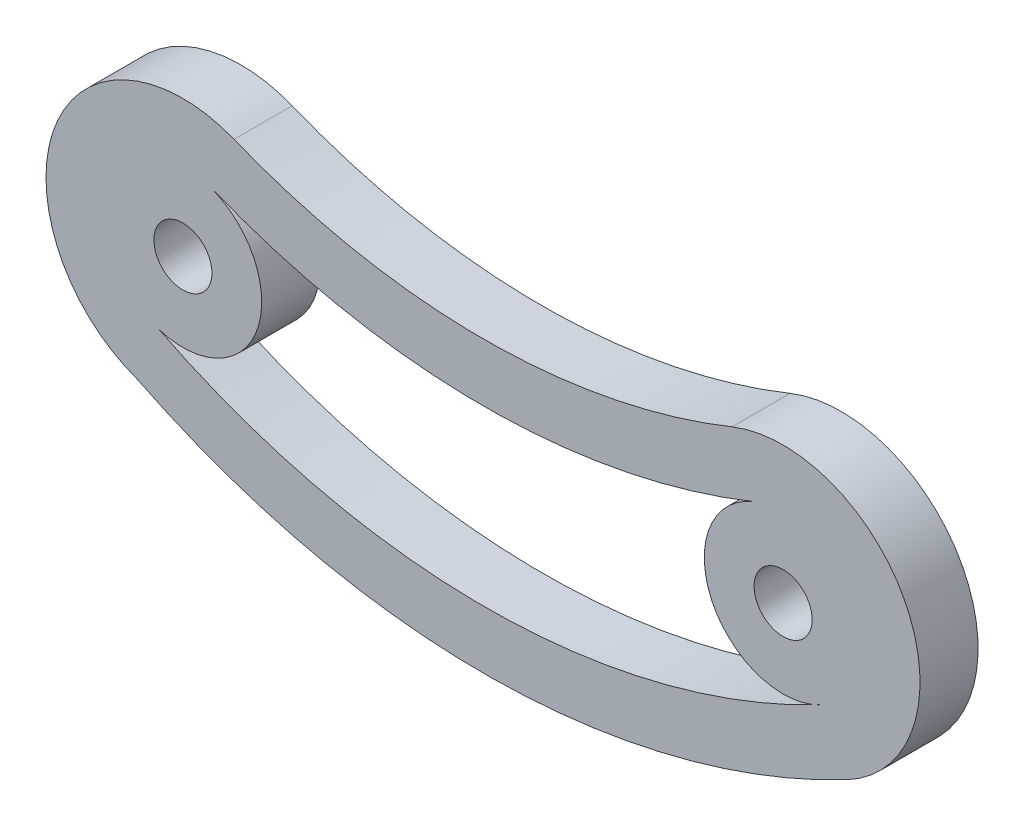
ISO-10303-21;
HEADER;
FILE_DESCRIPTION(('STEP AP214'),'2;1');
FILE_NAME('part.step','',(''),(''),'','','');
FILE_SCHEMA(('AUTOMOTIVE_DESIGN { 1 0 10303 214 1 1 1 1 }'));
ENDSEC;
DATA;
#1=APPLICATION_CONTEXT('core data for automotive mechanical design processes');
#2=APPLICATION_PROTOCOL_DEFINITION('international standard','automotive_design',2000,#1);
#3=PRODUCT_CONTEXT('',#1,'mechanical');
#4=PRODUCT('Part','Part','',(#3));
#5=PRODUCT_RELATED_PRODUCT_CATEGORY('part','',(#4));
#6=PRODUCT_DEFINITION_FORMATION('','',#4);
#7=PRODUCT_DEFINITION_CONTEXT('part definition',#1,'design');
#8=PRODUCT_DEFINITION('design','',#6,#7);
#9=PRODUCT_DEFINITION_SHAPE('','',#8);
#10=(LENGTH_UNIT() NAMED_UNIT(*) SI_UNIT(.MILLI.,.METRE.));
#11=(NAMED_UNIT(*) PLANE_ANGLE_UNIT() SI_UNIT($,.RADIAN.));
#12=(NAMED_UNIT(*) SI_UNIT($,.STERADIAN.) SOLID_ANGLE_UNIT());
#13=UNCERTAINTY_MEASURE_WITH_UNIT(LENGTH_MEASURE(1.E-05),#10,'distance_accuracy_value','');
#14=(GEOMETRIC_REPRESENTATION_CONTEXT(3) GLOBAL_UNCERTAINTY_ASSIGNED_CONTEXT((#13)) GLOBAL_UNIT_ASSIGNED_CONTEXT((#10,
#11,#12)) REPRESENTATION_CONTEXT('',''));
#15=CARTESIAN_POINT('',(0.,0.,0.));
#16=DIRECTION('',(0.,0.,1.));
#17=DIRECTION('',(1.,0.,0.));
#18=AXIS2_PLACEMENT_3D('',#15,#16,#17);
#19=CARTESIAN_POINT('',(15.5,-32.9667926412662,-3.));
#20=DIRECTION('',(0.,0.,-1.));
#21=DIRECTION('',(1.,0.,0.));
#22=AXIS2_PLACEMENT_3D('',#19,#20,#21);
#23=PLANE('',#22);
#24=CARTESIAN_POINT('',(31.,0.,-3.));
#25=DIRECTION('',(0.,0.,1.));
#26=DIRECTION('',(1.,0.,0.));
#27=AXIS2_PLACEMENT_3D('',#24,#25,#26);
#28=CIRCLE('',#27,1.5);
#29=CARTESIAN_POINT('',(32.5,0.,-3.));
#30=VERTEX_POINT('',#29);
#31=EDGE_CURVE('E43',#30,#30,#28,.T.);
#32=ORIENTED_EDGE('',*,*,#31,.T.);
#33=EDGE_LOOP('',(#32));
#34=FACE_BOUND('',#33,.T.);
#35=CARTESIAN_POINT('',(0.,0.,-3.));
#36=DIRECTION('',(0.,0.,1.));
#37=DIRECTION('',(1.,0.,0.));
#38=AXIS2_PLACEMENT_3D('',#35,#36,#37);
#39=CIRCLE('',#38,1.5);
#40=CARTESIAN_POINT('',(1.5,0.,-3.));
#41=VERTEX_POINT('',#40);
#42=EDGE_CURVE('E11',#41,#41,#39,.T.);
#43=ORIENTED_EDGE('',*,*,#42,.T.);
#44=EDGE_LOOP('',(#43));
#45=FACE_BOUND('',#44,.T.);
#46=CARTESIAN_POINT('',(0.,0.,-3.));
#47=DIRECTION('',(0.,0.,-1.));
#48=DIRECTION('',(-1.,0.,0.));
#49=AXIS2_PLACEMENT_3D('',#46,#47,#48);
#50=CIRCLE('',#49,7.07106781186548);
#51=CARTESIAN_POINT('',(-2.39609766795524,-6.65272244766152,-3.));
#52=VERTEX_POINT('',#51);
#53=CARTESIAN_POINT('',(2.63952486729692,6.55994729208408,-3.));
#54=VERTEX_POINT('',#53);
#55=EDGE_CURVE('E157',#52,#54,#50,.T.);
#56=ORIENTED_EDGE('',*,*,#55,.T.);
#57=CARTESIAN_POINT('',(15.5,38.5217749933269,-3.));
#58=DIRECTION('',(0.,0.,-1.));
#59=DIRECTION('',(-1.,0.,0.));
#60=AXIS2_PLACEMENT_3D('',#57,#58,#59);
#61=CIRCLE('',#60,34.452144354783);
#62=CARTESIAN_POINT('',(28.3604751327031,6.55994729208408,-3.));
#63=VERTEX_POINT('',#62);
#64=EDGE_CURVE('E147',#54,#63,#61,.F.);
#65=ORIENTED_EDGE('',*,*,#64,.T.);
#66=CARTESIAN_POINT('',(31.,0.,-3.));
#67=DIRECTION('',(0.,0.,-1.));
#68=DIRECTION('',(-1.,0.,0.));
#69=AXIS2_PLACEMENT_3D('',#66,#67,#68);
#70=CIRCLE('',#69,7.07106781186548);
#71=CARTESIAN_POINT('',(34.2886742958806,-6.25976208618301,-3.));
#72=VERTEX_POINT('',#71);
#73=EDGE_CURVE('E163',#63,#72,#70,.T.);
#74=ORIENTED_EDGE('',*,*,#73,.T.);
#75=CARTESIAN_POINT('',(15.5623695477377,29.3844525517841,-3.));
#76=DIRECTION('',(0.,0.,-1.));
#77=DIRECTION('',(-1.,0.,0.));
#78=AXIS2_PLACEMENT_3D('',#75,#76,#77);
#79=CIRCLE('',#78,40.2639358070941);
#80=EDGE_CURVE('E137',#52,#72,#79,.F.);
#81=ORIENTED_EDGE('',*,*,#80,.F.);
#82=EDGE_LOOP('',(#56,#65,#74,#81));
#83=FACE_BOUND('',#82,.T.);
#84=CARTESIAN_POINT('',(0.,0.,-3.));
#85=DIRECTION('',(0.,0.,1.));
#86=DIRECTION('',(1.,0.,0.));
#87=AXIS2_PLACEMENT_3D('',#84,#85,#86);
#88=CIRCLE('',#87,4.07106781186548);
#89=CARTESIAN_POINT('',(-1.23316593848006,-3.87980603857716,-3.));
#90=VERTEX_POINT('',#89);
#91=CARTESIAN_POINT('',(1.51966930763122,3.77679736340869,-3.));
#92=VERTEX_POINT('',#91);
#93=EDGE_CURVE('E131',#90,#92,#88,.T.);
#94=ORIENTED_EDGE('',*,*,#93,.F.);
#95=CARTESIAN_POINT('',(15.5623695477377,29.3844525517841,-3.));
#96=DIRECTION('',(0.,0.,1.));
#97=DIRECTION('',(1.,0.,0.));
#98=AXIS2_PLACEMENT_3D('',#95,#96,#97);
#99=CIRCLE('',#98,37.2639358070941);
#100=CARTESIAN_POINT('',(32.893407958442,-3.60396995433033,-3.));
#101=VERTEX_POINT('',#100);
#102=EDGE_CURVE('E129',#90,#101,#99,.T.);
#103=ORIENTED_EDGE('',*,*,#102,.T.);
#104=CARTESIAN_POINT('',(31.,0.,-3.));
#105=DIRECTION('',(0.,0.,1.));
#106=DIRECTION('',(1.,0.,0.));
#107=AXIS2_PLACEMENT_3D('',#104,#105,#106);
#108=CIRCLE('',#107,4.07106781186548);
#109=CARTESIAN_POINT('',(29.4803306923688,3.77679736340869,-3.));
#110=VERTEX_POINT('',#109);
#111=EDGE_CURVE('E106',#110,#101,#108,.T.);
#112=ORIENTED_EDGE('',*,*,#111,.F.);
#113=CARTESIAN_POINT('',(15.5,38.5217749933269,-3.));
#114=DIRECTION('',(0.,0.,1.));
#115=DIRECTION('',(1.,0.,0.));
#116=AXIS2_PLACEMENT_3D('',#113,#114,#115);
#117=CIRCLE('',#116,37.452144354783);
#118=EDGE_CURVE('E134',#92,#110,#117,.T.);
#119=ORIENTED_EDGE('',*,*,#118,.F.);
#120=EDGE_LOOP('',(#94,#103,#112,#119));
#121=FACE_BOUND('',#120,.T.);
#122=ADVANCED_FACE('F34',(#34,#45,#83,#121),#23,.T.);
#123=CARTESIAN_POINT('',(15.5,-32.9667926412662,0.));
#124=DIRECTION('',(0.,0.,-1.));
#125=DIRECTION('',(1.,0.,0.));
#126=AXIS2_PLACEMENT_3D('',#123,#124,#125);
#127=PLANE('',#126);
#128=CARTESIAN_POINT('',(31.,0.,0.));
#129=DIRECTION('',(0.,0.,1.));
#130=DIRECTION('',(1.,0.,0.));
#131=AXIS2_PLACEMENT_3D('',#128,#129,#130);
#132=CIRCLE('',#131,1.5);
#133=CARTESIAN_POINT('',(32.5,0.,0.));
#134=VERTEX_POINT('',#133);
#135=EDGE_CURVE('E166',#134,#134,#132,.T.);
#136=ORIENTED_EDGE('',*,*,#135,.F.);
#137=EDGE_LOOP('',(#136));
#138=FACE_BOUND('',#137,.T.);
#139=CARTESIAN_POINT('',(0.,0.,0.));
#140=DIRECTION('',(0.,0.,1.));
#141=DIRECTION('',(1.,0.,0.));
#142=AXIS2_PLACEMENT_3D('',#139,#140,#141);
#143=CIRCLE('',#142,1.5);
#144=CARTESIAN_POINT('',(1.5,0.,0.));
#145=VERTEX_POINT('',#144);
#146=EDGE_CURVE('E38',#145,#145,#143,.T.);
#147=ORIENTED_EDGE('',*,*,#146,.F.);
#148=EDGE_LOOP('',(#147));
#149=FACE_BOUND('',#148,.T.);
#150=CARTESIAN_POINT('',(15.5623695477377,29.3844525517841,0.));
#151=DIRECTION('',(0.,0.,-1.));
#152=DIRECTION('',(-1.,0.,0.));
#153=AXIS2_PLACEMENT_3D('',#150,#151,#152);
#154=CIRCLE('',#153,40.2639358070941);
#155=CARTESIAN_POINT('',(-2.39609766795524,-6.65272244766152,0.));
#156=VERTEX_POINT('',#155);
#157=CARTESIAN_POINT('',(34.2886742958806,-6.25976208618301,0.));
#158=VERTEX_POINT('',#157);
#159=EDGE_CURVE('E136',#156,#158,#154,.F.);
#160=ORIENTED_EDGE('',*,*,#159,.T.);
#161=CARTESIAN_POINT('',(31.,0.,0.));
#162=DIRECTION('',(0.,0.,-1.));
#163=DIRECTION('',(-1.,0.,0.));
#164=AXIS2_PLACEMENT_3D('',#161,#162,#163);
#165=CIRCLE('',#164,7.07106781186548);
#166=CARTESIAN_POINT('',(28.3604751327031,6.55994729208408,0.));
#167=VERTEX_POINT('',#166);
#168=EDGE_CURVE('E160',#167,#158,#165,.T.);
#169=ORIENTED_EDGE('',*,*,#168,.F.);
#170=CARTESIAN_POINT('',(15.5,38.5217749933269,0.));
#171=DIRECTION('',(0.,0.,-1.));
#172=DIRECTION('',(-1.,0.,0.));
#173=AXIS2_PLACEMENT_3D('',#170,#171,#172);
#174=CIRCLE('',#173,34.452144354783);
#175=CARTESIAN_POINT('',(2.63952486729692,6.55994729208408,0.));
#176=VERTEX_POINT('',#175);
#177=EDGE_CURVE('E145',#176,#167,#174,.F.);
#178=ORIENTED_EDGE('',*,*,#177,.F.);
#179=CARTESIAN_POINT('',(0.,0.,0.));
#180=DIRECTION('',(0.,0.,-1.));
#181=DIRECTION('',(-1.,0.,0.));
#182=AXIS2_PLACEMENT_3D('',#179,#180,#181);
#183=CIRCLE('',#182,7.07106781186548);
#184=EDGE_CURVE('E155',#156,#176,#183,.T.);
#185=ORIENTED_EDGE('',*,*,#184,.F.);
#186=EDGE_LOOP('',(#160,#169,#178,#185));
#187=FACE_BOUND('',#186,.T.);
#188=CARTESIAN_POINT('',(15.5,38.5217749933269,0.));
#189=DIRECTION('',(0.,0.,-1.));
#190=DIRECTION('',(-1.,0.,0.));
#191=AXIS2_PLACEMENT_3D('',#188,#189,#190);
#192=CIRCLE('',#191,37.452144354783);
#193=CARTESIAN_POINT('',(29.4803306923688,3.77679736340869,0.));
#194=VERTEX_POINT('',#193);
#195=CARTESIAN_POINT('',(1.51966930763122,3.77679736340869,0.));
#196=VERTEX_POINT('',#195);
#197=EDGE_CURVE('E119',#194,#196,#192,.T.);
#198=ORIENTED_EDGE('',*,*,#197,.F.);
#199=CARTESIAN_POINT('',(31.,0.,0.));
#200=DIRECTION('',(0.,0.,-1.));
#201=DIRECTION('',(-1.,0.,0.));
#202=AXIS2_PLACEMENT_3D('',#199,#200,#201);
#203=CIRCLE('',#202,4.07106781186548);
#204=CARTESIAN_POINT('',(32.893407958442,-3.60396995433033,0.));
#205=VERTEX_POINT('',#204);
#206=EDGE_CURVE('E103',#205,#194,#203,.T.);
#207=ORIENTED_EDGE('',*,*,#206,.F.);
#208=CARTESIAN_POINT('',(15.5623695477377,29.3844525517841,0.));
#209=DIRECTION('',(0.,0.,-1.));
#210=DIRECTION('',(-1.,0.,0.));
#211=AXIS2_PLACEMENT_3D('',#208,#209,#210);
#212=CIRCLE('',#211,37.2639358070941);
#213=CARTESIAN_POINT('',(-1.23316593848006,-3.87980603857716,0.));
#214=VERTEX_POINT('',#213);
#215=EDGE_CURVE('E111',#205,#214,#212,.T.);
#216=ORIENTED_EDGE('',*,*,#215,.T.);
#217=CARTESIAN_POINT('',(0.,0.,0.));
#218=DIRECTION('',(0.,0.,-1.));
#219=DIRECTION('',(-1.,0.,0.));
#220=AXIS2_PLACEMENT_3D('',#217,#218,#219);
#221=CIRCLE('',#220,4.07106781186548);
#222=EDGE_CURVE('E116',#196,#214,#221,.T.);
#223=ORIENTED_EDGE('',*,*,#222,.F.);
#224=EDGE_LOOP('',(#198,#207,#216,#223));
#225=FACE_BOUND('',#224,.T.);
#226=ADVANCED_FACE('F118',(#138,#149,#187,#225),#127,.F.);
#227=CARTESIAN_POINT('',(0.,0.,-3.));
#228=DIRECTION('',(0.,0.,1.));
#229=DIRECTION('',(-1.,0.,0.));
#230=AXIS2_PLACEMENT_3D('',#227,#228,#229);
#231=CYLINDRICAL_SURFACE('',#230,7.07106781186548);
#232=ORIENTED_EDGE('',*,*,#184,.T.);
#233=DIRECTION('',(0.,0.,1.));
#234=VECTOR('',#233,1.);
#235=CARTESIAN_POINT('',(2.63952486729692,6.55994729208408,-3.));
#236=LINE('',#235,#234);
#237=EDGE_CURVE('E150',#54,#176,#236,.T.);
#238=ORIENTED_EDGE('',*,*,#237,.F.);
#239=ORIENTED_EDGE('',*,*,#55,.F.);
#240=DIRECTION('',(0.,0.,1.));
#241=VECTOR('',#240,1.);
#242=CARTESIAN_POINT('',(-2.39609766795524,-6.65272244766152,-3.));
#243=LINE('',#242,#241);
#244=EDGE_CURVE('E140',#52,#156,#243,.T.);
#245=ORIENTED_EDGE('',*,*,#244,.T.);
#246=EDGE_LOOP('',(#232,#238,#239,#245));
#247=FACE_BOUND('',#246,.T.);
#248=ADVANCED_FACE('F180',(#247),#231,.T.);
#249=CARTESIAN_POINT('',(31.,0.,-3.));
#250=DIRECTION('',(0.,0.,1.));
#251=DIRECTION('',(-1.,0.,0.));
#252=AXIS2_PLACEMENT_3D('',#249,#250,#251);
#253=CYLINDRICAL_SURFACE('',#252,7.07106781186548);
#254=ORIENTED_EDGE('',*,*,#73,.F.);
#255=DIRECTION('',(0.,0.,1.));
#256=VECTOR('',#255,1.);
#257=CARTESIAN_POINT('',(28.3604751327031,6.55994729208408,-3.));
#258=LINE('',#257,#256);
#259=EDGE_CURVE('E153',#63,#167,#258,.T.);
#260=ORIENTED_EDGE('',*,*,#259,.T.);
#261=ORIENTED_EDGE('',*,*,#168,.T.);
#262=DIRECTION('',(0.,0.,1.));
#263=VECTOR('',#262,1.);
#264=CARTESIAN_POINT('',(34.2886742958806,-6.25976208618301,-3.));
#265=LINE('',#264,#263);
#266=EDGE_CURVE('E143',#72,#158,#265,.T.);
#267=ORIENTED_EDGE('',*,*,#266,.F.);
#268=EDGE_LOOP('',(#254,#260,#261,#267));
#269=FACE_BOUND('',#268,.T.);
#270=ADVANCED_FACE('F192',(#269),#253,.T.);
#271=CARTESIAN_POINT('',(0.,0.,-3.));
#272=DIRECTION('',(0.,0.,1.));
#273=DIRECTION('',(-1.,0.,0.));
#274=AXIS2_PLACEMENT_3D('',#271,#272,#273);
#275=CYLINDRICAL_SURFACE('',#274,1.5);
#276=ORIENTED_EDGE('',*,*,#42,.F.);
#277=EDGE_LOOP('',(#276));
#278=FACE_BOUND('',#277,.T.);
#279=ORIENTED_EDGE('',*,*,#146,.T.);
#280=EDGE_LOOP('',(#279));
#281=FACE_BOUND('',#280,.T.);
#282=ADVANCED_FACE('F176',(#278,#281),#275,.F.);
#283=CARTESIAN_POINT('',(31.,0.,-3.));
#284=DIRECTION('',(0.,0.,1.));
#285=DIRECTION('',(-1.,0.,0.));
#286=AXIS2_PLACEMENT_3D('',#283,#284,#285);
#287=CYLINDRICAL_SURFACE('',#286,1.5);
#288=ORIENTED_EDGE('',*,*,#31,.F.);
#289=EDGE_LOOP('',(#288));
#290=FACE_BOUND('',#289,.T.);
#291=ORIENTED_EDGE('',*,*,#135,.T.);
#292=EDGE_LOOP('',(#291));
#293=FACE_BOUND('',#292,.T.);
#294=ADVANCED_FACE('F36',(#290,#293),#287,.F.);
#295=CARTESIAN_POINT('',(15.5,38.5217749933269,-3.));
#296=DIRECTION('',(0.,0.,1.));
#297=DIRECTION('',(-1.,0.,0.));
#298=AXIS2_PLACEMENT_3D('',#295,#296,#297);
#299=CYLINDRICAL_SURFACE('',#298,34.452144354783);
#300=ORIENTED_EDGE('',*,*,#177,.T.);
#301=ORIENTED_EDGE('',*,*,#259,.F.);
#302=ORIENTED_EDGE('',*,*,#64,.F.);
#303=ORIENTED_EDGE('',*,*,#237,.T.);
#304=EDGE_LOOP('',(#300,#301,#302,#303));
#305=FACE_BOUND('',#304,.T.);
#306=ADVANCED_FACE('F195',(#305),#299,.F.);
#307=CARTESIAN_POINT('',(15.5623695477377,29.3844525517841,-3.));
#308=DIRECTION('',(0.,0.,1.));
#309=DIRECTION('',(-1.,0.,0.));
#310=AXIS2_PLACEMENT_3D('',#307,#308,#309);
#311=CYLINDRICAL_SURFACE('',#310,40.2639358070941);
#312=ORIENTED_EDGE('',*,*,#159,.F.);
#313=ORIENTED_EDGE('',*,*,#244,.F.);
#314=ORIENTED_EDGE('',*,*,#80,.T.);
#315=ORIENTED_EDGE('',*,*,#266,.T.);
#316=EDGE_LOOP('',(#312,#313,#314,#315));
#317=FACE_BOUND('',#316,.T.);
#318=ADVANCED_FACE('F188',(#317),#311,.T.);
#319=CARTESIAN_POINT('',(15.5,38.5217749933269,-5.));
#320=DIRECTION('',(0.,0.,1.));
#321=DIRECTION('',(-1.,0.,0.));
#322=AXIS2_PLACEMENT_3D('',#319,#320,#321);
#323=CYLINDRICAL_SURFACE('',#322,37.452144354783);
#324=DIRECTION('',(0.,0.,1.));
#325=VECTOR('',#324,1.);
#326=CARTESIAN_POINT('',(1.51966930763122,3.77679736340869,-5.));
#327=LINE('',#326,#325);
#328=EDGE_CURVE('E124',#92,#196,#327,.T.);
#329=ORIENTED_EDGE('',*,*,#328,.F.);
#330=ORIENTED_EDGE('',*,*,#118,.T.);
#331=DIRECTION('',(0.,0.,1.));
#332=VECTOR('',#331,1.);
#333=CARTESIAN_POINT('',(29.4803306923688,3.77679736340869,-5.));
#334=LINE('',#333,#332);
#335=EDGE_CURVE('E59',#110,#194,#334,.T.);
#336=ORIENTED_EDGE('',*,*,#335,.T.);
#337=ORIENTED_EDGE('',*,*,#197,.T.);
#338=EDGE_LOOP('',(#329,#330,#336,#337));
#339=FACE_BOUND('',#338,.T.);
#340=ADVANCED_FACE('F207',(#339),#323,.T.);
#341=CARTESIAN_POINT('',(0.,0.,-5.));
#342=DIRECTION('',(0.,0.,1.));
#343=DIRECTION('',(-1.,0.,0.));
#344=AXIS2_PLACEMENT_3D('',#341,#342,#343);
#345=CYLINDRICAL_SURFACE('',#344,4.07106781186548);
#346=DIRECTION('',(0.,0.,1.));
#347=VECTOR('',#346,1.);
#348=CARTESIAN_POINT('',(-1.23316593848006,-3.87980603857716,-5.));
#349=LINE('',#348,#347);
#350=EDGE_CURVE('E108',#90,#214,#349,.T.);
#351=ORIENTED_EDGE('',*,*,#350,.F.);
#352=ORIENTED_EDGE('',*,*,#93,.T.);
#353=ORIENTED_EDGE('',*,*,#328,.T.);
#354=ORIENTED_EDGE('',*,*,#222,.T.);
#355=EDGE_LOOP('',(#351,#352,#353,#354));
#356=FACE_BOUND('',#355,.T.);
#357=ADVANCED_FACE('F206',(#356),#345,.T.);
#358=CARTESIAN_POINT('',(15.5623695477377,29.3844525517841,-5.));
#359=DIRECTION('',(0.,0.,1.));
#360=DIRECTION('',(-1.,0.,0.));
#361=AXIS2_PLACEMENT_3D('',#358,#359,#360);
#362=CYLINDRICAL_SURFACE('',#361,37.2639358070941);
#363=ORIENTED_EDGE('',*,*,#102,.F.);
#364=ORIENTED_EDGE('',*,*,#350,.T.);
#365=ORIENTED_EDGE('',*,*,#215,.F.);
#366=DIRECTION('',(0.,0.,1.));
#367=VECTOR('',#366,1.);
#368=CARTESIAN_POINT('',(32.893407958442,-3.60396995433033,-5.));
#369=LINE('',#368,#367);
#370=EDGE_CURVE('E51',#101,#205,#369,.T.);
#371=ORIENTED_EDGE('',*,*,#370,.F.);
#372=EDGE_LOOP('',(#363,#364,#365,#371));
#373=FACE_BOUND('',#372,.T.);
#374=ADVANCED_FACE('F112',(#373),#362,.F.);
#375=CARTESIAN_POINT('',(31.,0.,-5.));
#376=DIRECTION('',(0.,0.,1.));
#377=DIRECTION('',(-1.,0.,0.));
#378=AXIS2_PLACEMENT_3D('',#375,#376,#377);
#379=CYLINDRICAL_SURFACE('',#378,4.07106781186548);
#380=ORIENTED_EDGE('',*,*,#335,.F.);
#381=ORIENTED_EDGE('',*,*,#111,.T.);
#382=ORIENTED_EDGE('',*,*,#370,.T.);
#383=ORIENTED_EDGE('',*,*,#206,.T.);
#384=EDGE_LOOP('',(#380,#381,#382,#383));
#385=FACE_BOUND('',#384,.T.);
#386=ADVANCED_FACE('F101',(#385),#379,.T.);
#387=CLOSED_SHELL('',(#122,#226,#248,#270,#282,#294,#306,#318,#340,#357,#374,#386));
#388=MANIFOLD_SOLID_BREP('B2',#387);
#389=ADVANCED_BREP_SHAPE_REPRESENTATION('',(#18,#388),#14);
#390=SHAPE_DEFINITION_REPRESENTATION(#9,#389);
ENDSEC;
END-ISO-10303-21;
